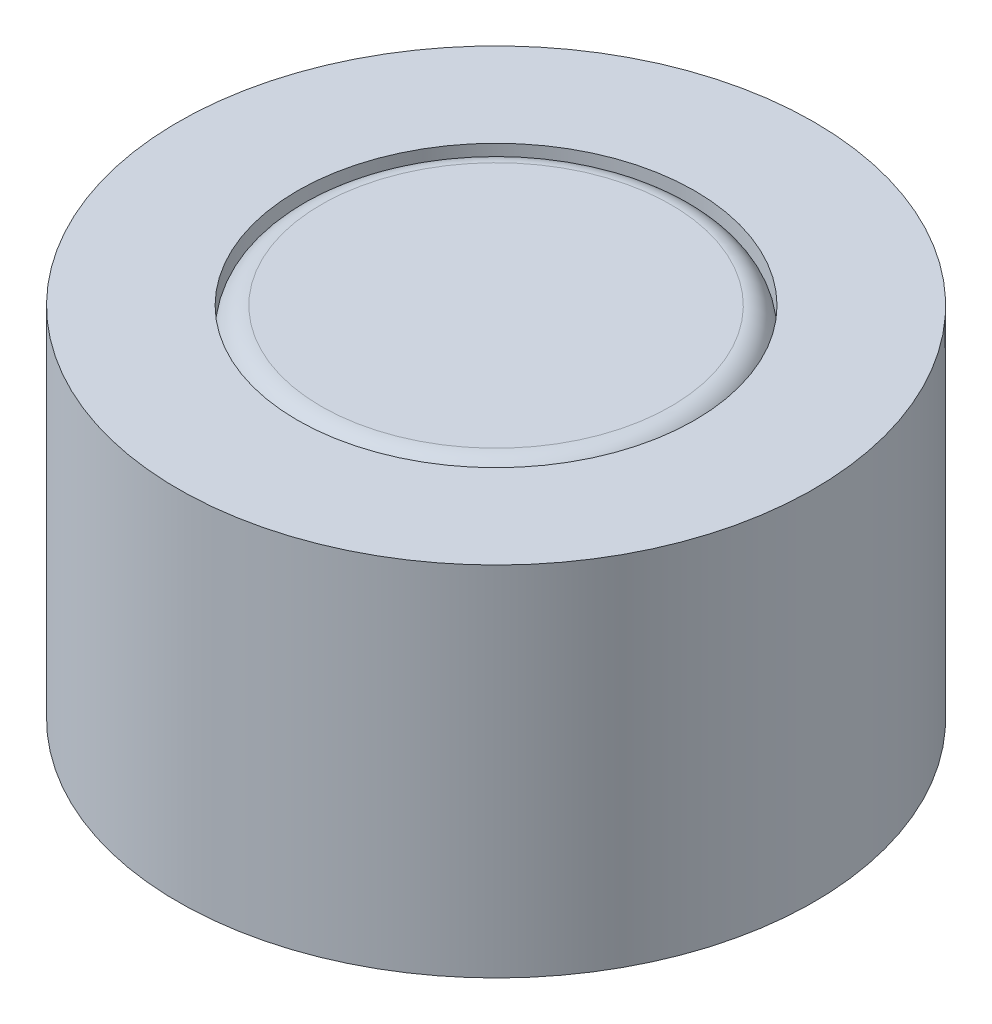
ISO-10303-21;
HEADER;
FILE_DESCRIPTION(('STEP AP214'),'2;1');
FILE_NAME('part.step','',(''),(''),'','','');
FILE_SCHEMA(('AUTOMOTIVE_DESIGN { 1 0 10303 214 1 1 1 1 }'));
ENDSEC;
DATA;
#1=APPLICATION_CONTEXT('core data for automotive mechanical design processes');
#2=APPLICATION_PROTOCOL_DEFINITION('international standard','automotive_design',2000,#1);
#3=PRODUCT_CONTEXT('',#1,'mechanical');
#4=PRODUCT('Part','Part','',(#3));
#5=PRODUCT_RELATED_PRODUCT_CATEGORY('part','',(#4));
#6=PRODUCT_DEFINITION_FORMATION('','',#4);
#7=PRODUCT_DEFINITION_CONTEXT('part definition',#1,'design');
#8=PRODUCT_DEFINITION('design','',#6,#7);
#9=PRODUCT_DEFINITION_SHAPE('','',#8);
#10=(LENGTH_UNIT() NAMED_UNIT(*) SI_UNIT(.MILLI.,.METRE.));
#11=(NAMED_UNIT(*) PLANE_ANGLE_UNIT() SI_UNIT($,.RADIAN.));
#12=(NAMED_UNIT(*) SI_UNIT($,.STERADIAN.) SOLID_ANGLE_UNIT());
#13=UNCERTAINTY_MEASURE_WITH_UNIT(LENGTH_MEASURE(1.E-05),#10,'distance_accuracy_value','');
#14=(GEOMETRIC_REPRESENTATION_CONTEXT(3) GLOBAL_UNCERTAINTY_ASSIGNED_CONTEXT((#13)) GLOBAL_UNIT_ASSIGNED_CONTEXT((#10,
#11,#12)) REPRESENTATION_CONTEXT('',''));
#15=CARTESIAN_POINT('',(0.,0.,0.));
#16=DIRECTION('',(0.,0.,1.));
#17=DIRECTION('',(1.,0.,0.));
#18=AXIS2_PLACEMENT_3D('',#15,#16,#17);
#19=CARTESIAN_POINT('',(0.,1.5,0.));
#20=DIRECTION('',(0.,-1.,0.));
#21=DIRECTION('',(0.,0.,-1.));
#22=AXIS2_PLACEMENT_3D('',#19,#20,#21);
#23=PLANE('',#22);
#24=CARTESIAN_POINT('',(0.,1.5,0.));
#25=DIRECTION('',(0.,-1.,0.));
#26=DIRECTION('',(0.,0.,-1.));
#27=AXIS2_PLACEMENT_3D('',#24,#25,#26);
#28=CIRCLE('',#27,2.2);
#29=CARTESIAN_POINT('',(0.,1.5,-2.2));
#30=VERTEX_POINT('',#29);
#31=EDGE_CURVE('E70',#30,#30,#28,.T.);
#32=ORIENTED_EDGE('',*,*,#31,.T.);
#33=EDGE_LOOP('',(#32));
#34=FACE_BOUND('',#33,.T.);
#35=ADVANCED_FACE('F55',(#34),#23,.T.);
#36=CARTESIAN_POINT('',(0.,0.,0.));
#37=DIRECTION('',(0.,-1.,0.));
#38=DIRECTION('',(0.,0.,-1.));
#39=AXIS2_PLACEMENT_3D('',#36,#37,#38);
#40=CYLINDRICAL_SURFACE('',#39,2.5);
#41=CARTESIAN_POINT('',(0.,1.8,0.));
#42=DIRECTION('',(0.,-1.,0.));
#43=DIRECTION('',(0.,0.,-1.));
#44=AXIS2_PLACEMENT_3D('',#41,#42,#43);
#45=CIRCLE('',#44,2.5);
#46=CARTESIAN_POINT('',(0.,1.8,-2.5));
#47=VERTEX_POINT('',#46);
#48=EDGE_CURVE('E62',#47,#47,#45,.F.);
#49=ORIENTED_EDGE('',*,*,#48,.T.);
#50=EDGE_LOOP('',(#49));
#51=FACE_BOUND('',#50,.T.);
#52=CARTESIAN_POINT('',(0.,4.2,0.));
#53=DIRECTION('',(0.,1.,0.));
#54=DIRECTION('',(0.,0.,1.));
#55=AXIS2_PLACEMENT_3D('',#52,#53,#54);
#56=CIRCLE('',#55,2.5);
#57=CARTESIAN_POINT('',(0.,4.2,2.5));
#58=VERTEX_POINT('',#57);
#59=EDGE_CURVE('E66',#58,#58,#56,.F.);
#60=ORIENTED_EDGE('',*,*,#59,.T.);
#61=EDGE_LOOP('',(#60));
#62=FACE_BOUND('',#61,.T.);
#63=ADVANCED_FACE('F86',(#51,#62),#40,.T.);
#64=CARTESIAN_POINT('',(0.,4.5,0.));
#65=DIRECTION('',(0.,1.,0.));
#66=DIRECTION('',(0.,0.,1.));
#67=AXIS2_PLACEMENT_3D('',#64,#65,#66);
#68=PLANE('',#67);
#69=CARTESIAN_POINT('',(0.,4.5,0.));
#70=DIRECTION('',(0.,1.,0.));
#71=DIRECTION('',(0.,0.,1.));
#72=AXIS2_PLACEMENT_3D('',#69,#70,#71);
#73=CIRCLE('',#72,2.2);
#74=CARTESIAN_POINT('',(0.,4.5,2.2));
#75=VERTEX_POINT('',#74);
#76=EDGE_CURVE('E11',#75,#75,#73,.T.);
#77=ORIENTED_EDGE('',*,*,#76,.T.);
#78=EDGE_LOOP('',(#77));
#79=FACE_BOUND('',#78,.T.);
#80=ADVANCED_FACE('F79',(#79),#68,.T.);
#81=CARTESIAN_POINT('',(0.,1.8,0.));
#82=DIRECTION('',(0.,-1.,0.));
#83=DIRECTION('',(0.,0.,-1.));
#84=AXIS2_PLACEMENT_3D('',#81,#82,#83);
#85=TOROIDAL_SURFACE('',#84,2.2,0.3);
#86=ORIENTED_EDGE('',*,*,#48,.F.);
#87=EDGE_LOOP('',(#86));
#88=FACE_BOUND('',#87,.T.);
#89=ORIENTED_EDGE('',*,*,#31,.F.);
#90=EDGE_LOOP('',(#89));
#91=FACE_BOUND('',#90,.T.);
#92=ADVANCED_FACE('F77',(#88,#91),#85,.T.);
#93=CARTESIAN_POINT('',(0.,4.2,0.));
#94=DIRECTION('',(0.,1.,0.));
#95=DIRECTION('',(0.,0.,1.));
#96=AXIS2_PLACEMENT_3D('',#93,#94,#95);
#97=TOROIDAL_SURFACE('',#96,2.2,0.3);
#98=ORIENTED_EDGE('',*,*,#76,.F.);
#99=EDGE_LOOP('',(#98));
#100=FACE_BOUND('',#99,.T.);
#101=ORIENTED_EDGE('',*,*,#59,.F.);
#102=EDGE_LOOP('',(#101));
#103=FACE_BOUND('',#102,.T.);
#104=ADVANCED_FACE('F57',(#100,#103),#97,.T.);
#105=CLOSED_SHELL('',(#35,#63,#80,#92,#104));
#106=MANIFOLD_SOLID_BREP('B2_NOT_SHOWN',#105);
#107=CARTESIAN_POINT('',(2.025,0.,0.));
#108=DIRECTION('',(0.,-1.,0.));
#109=DIRECTION('',(0.,0.,-1.));
#110=AXIS2_PLACEMENT_3D('',#107,#108,#109);
#111=PLANE('',#110);
#112=CARTESIAN_POINT('',(0.,0.,0.));
#113=DIRECTION('',(0.,-1.,0.));
#114=DIRECTION('',(0.,0.,-1.));
#115=AXIS2_PLACEMENT_3D('',#112,#113,#114);
#116=CIRCLE('',#115,4.);
#117=CARTESIAN_POINT('',(0.,0.,-4.));
#118=VERTEX_POINT('',#117);
#119=EDGE_CURVE('E54',#118,#118,#116,.T.);
#120=ORIENTED_EDGE('',*,*,#119,.T.);
#121=EDGE_LOOP('',(#120));
#122=FACE_BOUND('',#121,.T.);
#123=CARTESIAN_POINT('',(0.,0.,0.));
#124=DIRECTION('',(0.,-1.,0.));
#125=DIRECTION('',(0.,0.,-1.));
#126=AXIS2_PLACEMENT_3D('',#123,#124,#125);
#127=CIRCLE('',#126,2.025);
#128=CARTESIAN_POINT('',(0.,0.,-2.025));
#129=VERTEX_POINT('',#128);
#130=EDGE_CURVE('E148',#129,#129,#127,.T.);
#131=ORIENTED_EDGE('',*,*,#130,.F.);
#132=EDGE_LOOP('',(#131));
#133=FACE_BOUND('',#132,.T.);
#134=ADVANCED_FACE('F126',(#122,#133),#111,.T.);
#135=CARTESIAN_POINT('',(0.,0.,0.));
#136=DIRECTION('',(0.,-1.,0.));
#137=DIRECTION('',(0.,0.,-1.));
#138=AXIS2_PLACEMENT_3D('',#135,#136,#137);
#139=CYLINDRICAL_SURFACE('',#138,4.);
#140=CARTESIAN_POINT('',(0.,4.5,0.));
#141=DIRECTION('',(0.,-1.,0.));
#142=DIRECTION('',(0.,0.,-1.));
#143=AXIS2_PLACEMENT_3D('',#140,#141,#142);
#144=CIRCLE('',#143,4.);
#145=CARTESIAN_POINT('',(0.,4.5,-4.));
#146=VERTEX_POINT('',#145);
#147=EDGE_CURVE('E132',#146,#146,#144,.T.);
#148=ORIENTED_EDGE('',*,*,#147,.T.);
#149=EDGE_LOOP('',(#148));
#150=FACE_BOUND('',#149,.T.);
#151=ORIENTED_EDGE('',*,*,#119,.F.);
#152=EDGE_LOOP('',(#151));
#153=FACE_BOUND('',#152,.T.);
#154=ADVANCED_FACE('F156',(#150,#153),#139,.T.);
#155=CARTESIAN_POINT('',(4.,4.5,0.));
#156=DIRECTION('',(0.,1.,0.));
#157=DIRECTION('',(0.,0.,1.));
#158=AXIS2_PLACEMENT_3D('',#155,#156,#157);
#159=PLANE('',#158);
#160=CARTESIAN_POINT('',(0.,4.5,0.));
#161=DIRECTION('',(0.,-1.,0.));
#162=DIRECTION('',(0.,0.,-1.));
#163=AXIS2_PLACEMENT_3D('',#160,#161,#162);
#164=CIRCLE('',#163,2.5);
#165=CARTESIAN_POINT('',(0.,4.5,-2.5));
#166=VERTEX_POINT('',#165);
#167=EDGE_CURVE('E136',#166,#166,#164,.T.);
#168=ORIENTED_EDGE('',*,*,#167,.T.);
#169=EDGE_LOOP('',(#168));
#170=FACE_BOUND('',#169,.T.);
#171=ORIENTED_EDGE('',*,*,#147,.F.);
#172=EDGE_LOOP('',(#171));
#173=FACE_BOUND('',#172,.T.);
#174=ADVANCED_FACE('F162',(#170,#173),#159,.T.);
#175=CARTESIAN_POINT('',(0.,0.,0.));
#176=DIRECTION('',(0.,-1.,0.));
#177=DIRECTION('',(0.,0.,-1.));
#178=AXIS2_PLACEMENT_3D('',#175,#176,#177);
#179=CYLINDRICAL_SURFACE('',#178,2.5);
#180=CARTESIAN_POINT('',(0.,1.5,0.));
#181=DIRECTION('',(0.,-1.,0.));
#182=DIRECTION('',(0.,0.,-1.));
#183=AXIS2_PLACEMENT_3D('',#180,#181,#182);
#184=CIRCLE('',#183,2.5);
#185=CARTESIAN_POINT('',(0.,1.5,-2.5));
#186=VERTEX_POINT('',#185);
#187=EDGE_CURVE('E140',#186,#186,#184,.T.);
#188=ORIENTED_EDGE('',*,*,#187,.T.);
#189=EDGE_LOOP('',(#188));
#190=FACE_BOUND('',#189,.T.);
#191=ORIENTED_EDGE('',*,*,#167,.F.);
#192=EDGE_LOOP('',(#191));
#193=FACE_BOUND('',#192,.T.);
#194=ADVANCED_FACE('F167',(#190,#193),#179,.F.);
#195=CARTESIAN_POINT('',(2.5,1.5,0.));
#196=DIRECTION('',(0.,1.,0.));
#197=DIRECTION('',(0.,0.,1.));
#198=AXIS2_PLACEMENT_3D('',#195,#196,#197);
#199=PLANE('',#198);
#200=CARTESIAN_POINT('',(0.,1.5,0.));
#201=DIRECTION('',(0.,-1.,0.));
#202=DIRECTION('',(0.,0.,-1.));
#203=AXIS2_PLACEMENT_3D('',#200,#201,#202);
#204=CIRCLE('',#203,2.025);
#205=CARTESIAN_POINT('',(0.,1.5,-2.025));
#206=VERTEX_POINT('',#205);
#207=EDGE_CURVE('E145',#206,#206,#204,.T.);
#208=ORIENTED_EDGE('',*,*,#207,.T.);
#209=EDGE_LOOP('',(#208));
#210=FACE_BOUND('',#209,.T.);
#211=ORIENTED_EDGE('',*,*,#187,.F.);
#212=EDGE_LOOP('',(#211));
#213=FACE_BOUND('',#212,.T.);
#214=ADVANCED_FACE('F173',(#210,#213),#199,.T.);
#215=CARTESIAN_POINT('',(0.,0.,0.));
#216=DIRECTION('',(0.,-1.,0.));
#217=DIRECTION('',(0.,0.,-1.));
#218=AXIS2_PLACEMENT_3D('',#215,#216,#217);
#219=CYLINDRICAL_SURFACE('',#218,2.025);
#220=ORIENTED_EDGE('',*,*,#130,.T.);
#221=EDGE_LOOP('',(#220));
#222=FACE_BOUND('',#221,.T.);
#223=ORIENTED_EDGE('',*,*,#207,.F.);
#224=EDGE_LOOP('',(#223));
#225=FACE_BOUND('',#224,.T.);
#226=ADVANCED_FACE('F152',(#222,#225),#219,.F.);
#227=CLOSED_SHELL('',(#134,#154,#174,#194,#214,#226));
#228=MANIFOLD_SOLID_BREP('B6',#227);
#229=ADVANCED_BREP_SHAPE_REPRESENTATION('',(#18,#106,#228),#14);
#230=SHAPE_DEFINITION_REPRESENTATION(#9,#229);
ENDSEC;
END-ISO-10303-21;
